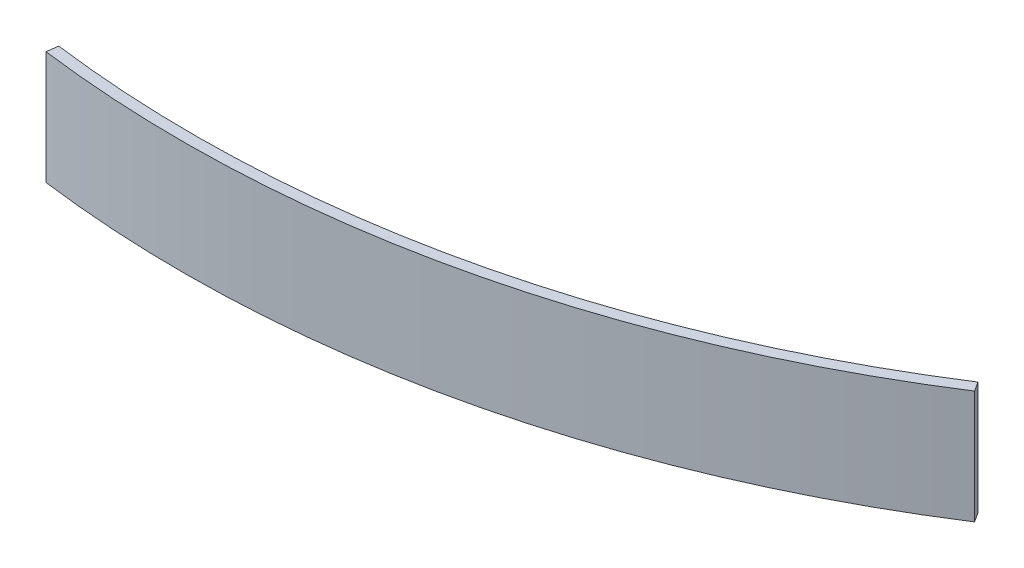
ISO-10303-21;
HEADER;
FILE_DESCRIPTION(('STEP AP214'),'2;1');
FILE_NAME('part.step','',(''),(''),'','','');
FILE_SCHEMA(('AUTOMOTIVE_DESIGN { 1 0 10303 214 1 1 1 1 }'));
ENDSEC;
DATA;
#1=APPLICATION_CONTEXT('core data for automotive mechanical design processes');
#2=APPLICATION_PROTOCOL_DEFINITION('international standard','automotive_design',2000,#1);
#3=PRODUCT_CONTEXT('',#1,'mechanical');
#4=PRODUCT('Part','Part','',(#3));
#5=PRODUCT_RELATED_PRODUCT_CATEGORY('part','',(#4));
#6=PRODUCT_DEFINITION_FORMATION('','',#4);
#7=PRODUCT_DEFINITION_CONTEXT('part definition',#1,'design');
#8=PRODUCT_DEFINITION('design','',#6,#7);
#9=PRODUCT_DEFINITION_SHAPE('','',#8);
#10=(LENGTH_UNIT() NAMED_UNIT(*) SI_UNIT(.MILLI.,.METRE.));
#11=(NAMED_UNIT(*) PLANE_ANGLE_UNIT() SI_UNIT($,.RADIAN.));
#12=(NAMED_UNIT(*) SI_UNIT($,.STERADIAN.) SOLID_ANGLE_UNIT());
#13=UNCERTAINTY_MEASURE_WITH_UNIT(LENGTH_MEASURE(1.E-05),#10,'distance_accuracy_value','');
#14=(GEOMETRIC_REPRESENTATION_CONTEXT(3) GLOBAL_UNCERTAINTY_ASSIGNED_CONTEXT((#13)) GLOBAL_UNIT_ASSIGNED_CONTEXT((#10,
#11,#12)) REPRESENTATION_CONTEXT('',''));
#15=CARTESIAN_POINT('',(0.,0.,0.));
#16=DIRECTION('',(0.,0.,1.));
#17=DIRECTION('',(1.,0.,0.));
#18=AXIS2_PLACEMENT_3D('',#15,#16,#17);
#19=CARTESIAN_POINT('',(0.,100.,0.));
#20=DIRECTION('',(0.,-1.,0.));
#21=DIRECTION('',(0.,0.,-1.));
#22=AXIS2_PLACEMENT_3D('',#19,#20,#21);
#23=CYLINDRICAL_SURFACE('',#22,990.);
#24=CARTESIAN_POINT('',(0.,0.,0.));
#25=DIRECTION('',(0.,1.,0.));
#26=DIRECTION('',(0.,0.,1.));
#27=AXIS2_PLACEMENT_3D('',#24,#25,#26);
#28=CIRCLE('',#27,990.);
#29=CARTESIAN_POINT('',(-127.334938088599,0.,981.776865454657));
#30=VERTEX_POINT('',#29);
#31=CARTESIAN_POINT('',(535.086889081248,0.,832.935784519642));
#32=VERTEX_POINT('',#31);
#33=EDGE_CURVE('E99',#30,#32,#28,.T.);
#34=ORIENTED_EDGE('',*,*,#33,.F.);
#35=DIRECTION('',(0.,-1.,0.));
#36=VECTOR('',#35,1.);
#37=CARTESIAN_POINT('',(-127.334938088599,100.,981.776865454657));
#38=LINE('',#37,#36);
#39=CARTESIAN_POINT('',(-127.334938088599,100.,981.776865454657));
#40=VERTEX_POINT('',#39);
#41=EDGE_CURVE('E11',#40,#30,#38,.T.);
#42=ORIENTED_EDGE('',*,*,#41,.F.);
#43=CARTESIAN_POINT('',(0.,100.,0.));
#44=DIRECTION('',(0.,1.,0.));
#45=DIRECTION('',(0.,0.,1.));
#46=AXIS2_PLACEMENT_3D('',#43,#44,#45);
#47=CIRCLE('',#46,990.);
#48=CARTESIAN_POINT('',(535.086889081248,100.,832.935784519642));
#49=VERTEX_POINT('',#48);
#50=EDGE_CURVE('E93',#40,#49,#47,.T.);
#51=ORIENTED_EDGE('',*,*,#50,.T.);
#52=DIRECTION('',(0.,-1.,0.));
#53=VECTOR('',#52,1.);
#54=CARTESIAN_POINT('',(535.086889081248,100.,832.935784519642));
#55=LINE('',#54,#53);
#56=EDGE_CURVE('E51',#49,#32,#55,.T.);
#57=ORIENTED_EDGE('',*,*,#56,.T.);
#58=EDGE_LOOP('',(#34,#42,#51,#57));
#59=FACE_BOUND('',#58,.T.);
#60=ADVANCED_FACE('F35',(#59),#23,.F.);
#61=CARTESIAN_POINT('',(0.,100.,0.));
#62=DIRECTION('',(-0.991693803489553,0.,-0.128621149584444));
#63=DIRECTION('',(-0.128621149584444,0.,0.991693803489553));
#64=AXIS2_PLACEMENT_3D('',#61,#62,#63);
#65=PLANE('',#64);
#66=DIRECTION('',(0.128621149584444,0.,-0.991693803489553));
#67=VECTOR('',#66,1.);
#68=CARTESIAN_POINT('',(0.,0.,0.));
#69=LINE('',#68,#67);
#70=CARTESIAN_POINT('',(-128.621149584444,0.,991.693803489553));
#71=VERTEX_POINT('',#70);
#72=EDGE_CURVE('E83',#71,#30,#69,.T.);
#73=ORIENTED_EDGE('',*,*,#72,.F.);
#74=DIRECTION('',(0.,-1.,0.));
#75=VECTOR('',#74,1.);
#76=CARTESIAN_POINT('',(-128.621149584444,100.,991.693803489553));
#77=LINE('',#76,#75);
#78=CARTESIAN_POINT('',(-128.621149584444,100.,991.693803489553));
#79=VERTEX_POINT('',#78);
#80=EDGE_CURVE('E43',#79,#71,#77,.T.);
#81=ORIENTED_EDGE('',*,*,#80,.F.);
#82=DIRECTION('',(0.128621149584444,0.,-0.991693803489553));
#83=VECTOR('',#82,1.);
#84=CARTESIAN_POINT('',(0.,100.,0.));
#85=LINE('',#84,#83);
#86=EDGE_CURVE('E81',#79,#40,#85,.T.);
#87=ORIENTED_EDGE('',*,*,#86,.T.);
#88=ORIENTED_EDGE('',*,*,#41,.T.);
#89=EDGE_LOOP('',(#73,#81,#87,#88));
#90=FACE_BOUND('',#89,.T.);
#91=ADVANCED_FACE('F79',(#90),#65,.T.);
#92=CARTESIAN_POINT('',(0.,100.,0.));
#93=DIRECTION('',(0.,-1.,0.));
#94=DIRECTION('',(0.,0.,-1.));
#95=AXIS2_PLACEMENT_3D('',#92,#93,#94);
#96=CYLINDRICAL_SURFACE('',#95,1000.);
#97=CARTESIAN_POINT('',(0.,0.,0.));
#98=DIRECTION('',(0.,1.,0.));
#99=DIRECTION('',(0.,0.,1.));
#100=AXIS2_PLACEMENT_3D('',#97,#98,#99);
#101=CIRCLE('',#100,1000.);
#102=CARTESIAN_POINT('',(540.491807152776,0.,841.349277292568));
#103=VERTEX_POINT('',#102);
#104=EDGE_CURVE('E102',#71,#103,#101,.T.);
#105=ORIENTED_EDGE('',*,*,#104,.T.);
#106=DIRECTION('',(0.,-1.,0.));
#107=VECTOR('',#106,1.);
#108=CARTESIAN_POINT('',(540.491807152776,100.,841.349277292568));
#109=LINE('',#108,#107);
#110=CARTESIAN_POINT('',(540.491807152776,100.,841.349277292568));
#111=VERTEX_POINT('',#110);
#112=EDGE_CURVE('E65',#111,#103,#109,.T.);
#113=ORIENTED_EDGE('',*,*,#112,.F.);
#114=CARTESIAN_POINT('',(0.,100.,0.));
#115=DIRECTION('',(0.,1.,0.));
#116=DIRECTION('',(0.,0.,1.));
#117=AXIS2_PLACEMENT_3D('',#114,#115,#116);
#118=CIRCLE('',#117,1000.);
#119=EDGE_CURVE('E86',#79,#111,#118,.T.);
#120=ORIENTED_EDGE('',*,*,#119,.F.);
#121=ORIENTED_EDGE('',*,*,#80,.T.);
#122=EDGE_LOOP('',(#105,#113,#120,#121));
#123=FACE_BOUND('',#122,.T.);
#124=ADVANCED_FACE('F87',(#123),#96,.T.);
#125=CARTESIAN_POINT('',(0.,100.,0.));
#126=DIRECTION('',(0.841349277292568,0.,-0.540491807152776));
#127=DIRECTION('',(-0.540491807152776,0.,-0.841349277292568));
#128=AXIS2_PLACEMENT_3D('',#125,#126,#127);
#129=PLANE('',#128);
#130=DIRECTION('',(0.540491807152776,0.,0.841349277292568));
#131=VECTOR('',#130,1.);
#132=CARTESIAN_POINT('',(0.,0.,0.));
#133=LINE('',#132,#131);
#134=EDGE_CURVE('E95',#32,#103,#133,.T.);
#135=ORIENTED_EDGE('',*,*,#134,.F.);
#136=ORIENTED_EDGE('',*,*,#56,.F.);
#137=DIRECTION('',(0.540491807152776,0.,0.841349277292568));
#138=VECTOR('',#137,1.);
#139=CARTESIAN_POINT('',(0.,100.,0.));
#140=LINE('',#139,#138);
#141=EDGE_CURVE('E90',#49,#111,#140,.T.);
#142=ORIENTED_EDGE('',*,*,#141,.T.);
#143=ORIENTED_EDGE('',*,*,#112,.T.);
#144=EDGE_LOOP('',(#135,#136,#142,#143));
#145=FACE_BOUND('',#144,.T.);
#146=ADVANCED_FACE('F109',(#145),#129,.T.);
#147=CARTESIAN_POINT('',(0.,100.,0.));
#148=DIRECTION('',(0.,1.,0.));
#149=DIRECTION('',(0.,0.,1.));
#150=AXIS2_PLACEMENT_3D('',#147,#148,#149);
#151=PLANE('',#150);
#152=ORIENTED_EDGE('',*,*,#50,.F.);
#153=ORIENTED_EDGE('',*,*,#86,.F.);
#154=ORIENTED_EDGE('',*,*,#119,.T.);
#155=ORIENTED_EDGE('',*,*,#141,.F.);
#156=EDGE_LOOP('',(#152,#153,#154,#155));
#157=FACE_BOUND('',#156,.T.);
#158=ADVANCED_FACE('F92',(#157),#151,.T.);
#159=CARTESIAN_POINT('',(0.,0.,0.));
#160=DIRECTION('',(0.,1.,0.));
#161=DIRECTION('',(0.,0.,1.));
#162=AXIS2_PLACEMENT_3D('',#159,#160,#161);
#163=PLANE('',#162);
#164=ORIENTED_EDGE('',*,*,#33,.T.);
#165=ORIENTED_EDGE('',*,*,#134,.T.);
#166=ORIENTED_EDGE('',*,*,#104,.F.);
#167=ORIENTED_EDGE('',*,*,#72,.T.);
#168=EDGE_LOOP('',(#164,#165,#166,#167));
#169=FACE_BOUND('',#168,.T.);
#170=ADVANCED_FACE('F108',(#169),#163,.F.);
#171=CLOSED_SHELL('',(#60,#91,#124,#146,#158,#170));
#172=MANIFOLD_SOLID_BREP('B2',#171);
#173=ADVANCED_BREP_SHAPE_REPRESENTATION('',(#18,#172),#14);
#174=SHAPE_DEFINITION_REPRESENTATION(#9,#173);
ENDSEC;
END-ISO-10303-21;
